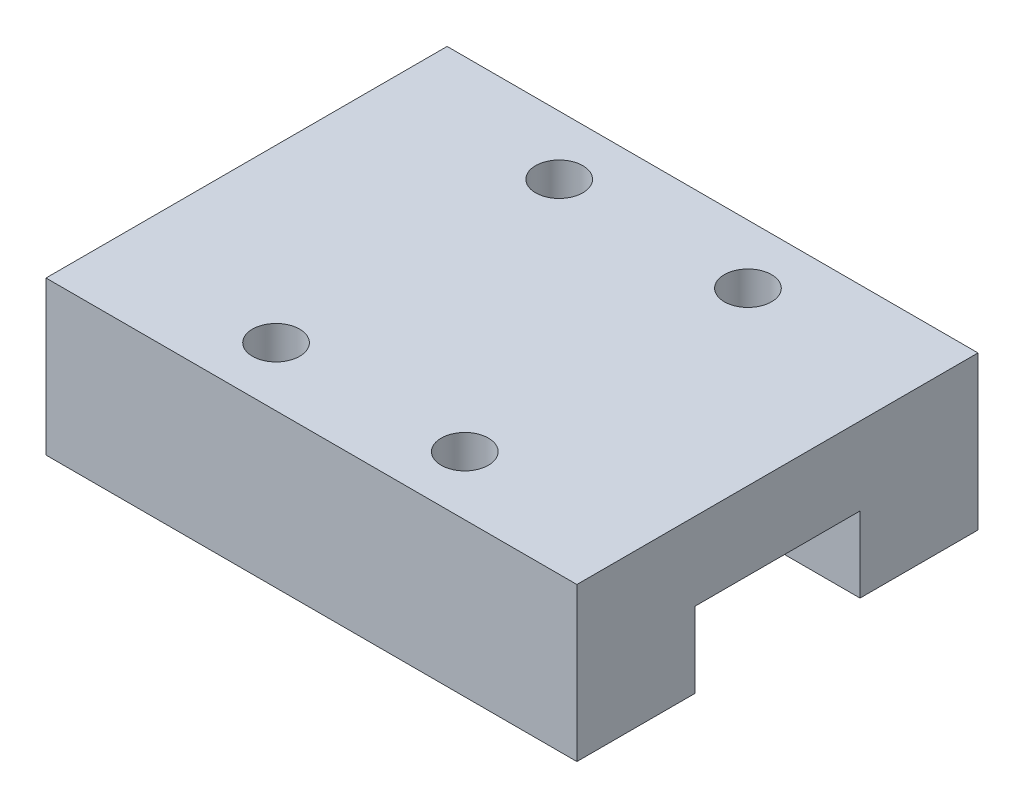
ISO-10303-21;
HEADER;
FILE_DESCRIPTION(('STEP AP214'),'2;1');
FILE_NAME('part.step','',(''),(''),'','','');
FILE_SCHEMA(('AUTOMOTIVE_DESIGN { 1 0 10303 214 1 1 1 1 }'));
ENDSEC;
DATA;
#1=APPLICATION_CONTEXT('core data for automotive mechanical design processes');
#2=APPLICATION_PROTOCOL_DEFINITION('international standard','automotive_design',2000,#1);
#3=PRODUCT_CONTEXT('',#1,'mechanical');
#4=PRODUCT('Part','Part','',(#3));
#5=PRODUCT_RELATED_PRODUCT_CATEGORY('part','',(#4));
#6=PRODUCT_DEFINITION_FORMATION('','',#4);
#7=PRODUCT_DEFINITION_CONTEXT('part definition',#1,'design');
#8=PRODUCT_DEFINITION('design','',#6,#7);
#9=PRODUCT_DEFINITION_SHAPE('','',#8);
#10=(LENGTH_UNIT() NAMED_UNIT(*) SI_UNIT(.MILLI.,.METRE.));
#11=(NAMED_UNIT(*) PLANE_ANGLE_UNIT() SI_UNIT($,.RADIAN.));
#12=(NAMED_UNIT(*) SI_UNIT($,.STERADIAN.) SOLID_ANGLE_UNIT());
#13=UNCERTAINTY_MEASURE_WITH_UNIT(LENGTH_MEASURE(1.E-05),#10,'distance_accuracy_value','');
#14=(GEOMETRIC_REPRESENTATION_CONTEXT(3) GLOBAL_UNCERTAINTY_ASSIGNED_CONTEXT((#13)) GLOBAL_UNIT_ASSIGNED_CONTEXT((#10,
#11,#12)) REPRESENTATION_CONTEXT('',''));
#15=CARTESIAN_POINT('',(0.,0.,0.));
#16=DIRECTION('',(0.,0.,1.));
#17=DIRECTION('',(1.,0.,0.));
#18=AXIS2_PLACEMENT_3D('',#15,#16,#17);
#19=CARTESIAN_POINT('',(0.,0.,0.));
#20=DIRECTION('',(0.,-1.,0.));
#21=DIRECTION('',(0.,0.,-1.));
#22=AXIS2_PLACEMENT_3D('',#19,#20,#21);
#23=PLANE('',#22);
#24=DIRECTION('',(-1.,0.,0.));
#25=VECTOR('',#24,1.);
#26=CARTESIAN_POINT('',(22.5,0.,-12.));
#27=LINE('',#26,#25);
#28=CARTESIAN_POINT('',(22.5,0.,-12.));
#29=VERTEX_POINT('',#28);
#30=CARTESIAN_POINT('',(0.,0.,-12.));
#31=VERTEX_POINT('',#30);
#32=EDGE_CURVE('E114',#29,#31,#27,.T.);
#33=ORIENTED_EDGE('',*,*,#32,.T.);
#34=DIRECTION('',(0.,0.,1.));
#35=VECTOR('',#34,1.);
#36=CARTESIAN_POINT('',(0.,0.,0.));
#37=LINE('',#36,#35);
#38=CARTESIAN_POINT('',(0.,0.,-17.));
#39=VERTEX_POINT('',#38);
#40=EDGE_CURVE('E139',#39,#31,#37,.T.);
#41=ORIENTED_EDGE('',*,*,#40,.F.);
#42=DIRECTION('',(-1.,0.,0.));
#43=VECTOR('',#42,1.);
#44=CARTESIAN_POINT('',(0.,0.,-17.));
#45=LINE('',#44,#43);
#46=CARTESIAN_POINT('',(22.5,0.,-17.));
#47=VERTEX_POINT('',#46);
#48=EDGE_CURVE('E85',#47,#39,#45,.T.);
#49=ORIENTED_EDGE('',*,*,#48,.F.);
#50=DIRECTION('',(0.,0.,-1.));
#51=VECTOR('',#50,1.);
#52=CARTESIAN_POINT('',(22.5,0.,0.));
#53=LINE('',#52,#51);
#54=EDGE_CURVE('E131',#29,#47,#53,.T.);
#55=ORIENTED_EDGE('',*,*,#54,.F.);
#56=EDGE_LOOP('',(#33,#41,#49,#55));
#57=FACE_BOUND('',#56,.T.);
#58=ADVANCED_FACE('F40',(#57),#23,.T.);
#59=CARTESIAN_POINT('',(0.,6.5,0.));
#60=DIRECTION('',(1.,0.,0.));
#61=DIRECTION('',(0.,0.,-1.));
#62=AXIS2_PLACEMENT_3D('',#59,#60,#61);
#63=PLANE('',#62);
#64=ORIENTED_EDGE('',*,*,#40,.T.);
#65=DIRECTION('',(0.,-1.,0.));
#66=VECTOR('',#65,1.);
#67=CARTESIAN_POINT('',(0.,3.2,-12.));
#68=LINE('',#67,#66);
#69=CARTESIAN_POINT('',(0.,3.2,-12.));
#70=VERTEX_POINT('',#69);
#71=EDGE_CURVE('E120',#70,#31,#68,.T.);
#72=ORIENTED_EDGE('',*,*,#71,.F.);
#73=DIRECTION('',(0.,0.,-1.));
#74=VECTOR('',#73,1.);
#75=CARTESIAN_POINT('',(0.,3.2,-12.));
#76=LINE('',#75,#74);
#77=CARTESIAN_POINT('',(0.,3.2,-5.));
#78=VERTEX_POINT('',#77);
#79=EDGE_CURVE('E133',#78,#70,#76,.T.);
#80=ORIENTED_EDGE('',*,*,#79,.F.);
#81=DIRECTION('',(0.,1.,0.));
#82=VECTOR('',#81,1.);
#83=CARTESIAN_POINT('',(0.,3.2,-5.));
#84=LINE('',#83,#82);
#85=CARTESIAN_POINT('',(0.,0.,-5.));
#86=VERTEX_POINT('',#85);
#87=EDGE_CURVE('E173',#86,#78,#84,.T.);
#88=ORIENTED_EDGE('',*,*,#87,.F.);
#89=CARTESIAN_POINT('',(0.,0.,0.));
#90=VERTEX_POINT('',#89);
#91=EDGE_CURVE('E156',#86,#90,#37,.T.);
#92=ORIENTED_EDGE('',*,*,#91,.T.);
#93=DIRECTION('',(0.,-1.,0.));
#94=VECTOR('',#93,1.);
#95=CARTESIAN_POINT('',(0.,6.5,0.));
#96=LINE('',#95,#94);
#97=CARTESIAN_POINT('',(0.,6.5,0.));
#98=VERTEX_POINT('',#97);
#99=EDGE_CURVE('E11',#98,#90,#96,.T.);
#100=ORIENTED_EDGE('',*,*,#99,.F.);
#101=DIRECTION('',(0.,0.,1.));
#102=VECTOR('',#101,1.);
#103=CARTESIAN_POINT('',(0.,6.5,0.));
#104=LINE('',#103,#102);
#105=CARTESIAN_POINT('',(0.,6.5,-17.));
#106=VERTEX_POINT('',#105);
#107=EDGE_CURVE('E144',#106,#98,#104,.T.);
#108=ORIENTED_EDGE('',*,*,#107,.F.);
#109=DIRECTION('',(0.,-1.,0.));
#110=VECTOR('',#109,1.);
#111=CARTESIAN_POINT('',(0.,6.5,-17.));
#112=LINE('',#111,#110);
#113=EDGE_CURVE('E145',#106,#39,#112,.T.);
#114=ORIENTED_EDGE('',*,*,#113,.T.);
#115=EDGE_LOOP('',(#64,#72,#80,#88,#92,#100,#108,#114));
#116=FACE_BOUND('',#115,.T.);
#117=ADVANCED_FACE('F42',(#116),#63,.F.);
#118=CARTESIAN_POINT('',(0.,6.5,0.));
#119=DIRECTION('',(0.,0.,-1.));
#120=DIRECTION('',(-1.,0.,0.));
#121=AXIS2_PLACEMENT_3D('',#118,#119,#120);
#122=PLANE('',#121);
#123=DIRECTION('',(1.,0.,0.));
#124=VECTOR('',#123,1.);
#125=CARTESIAN_POINT('',(0.,0.,0.));
#126=LINE('',#125,#124);
#127=CARTESIAN_POINT('',(22.5,0.,0.));
#128=VERTEX_POINT('',#127);
#129=EDGE_CURVE('E136',#90,#128,#126,.T.);
#130=ORIENTED_EDGE('',*,*,#129,.T.);
#131=DIRECTION('',(0.,-1.,0.));
#132=VECTOR('',#131,1.);
#133=CARTESIAN_POINT('',(22.5,6.5,0.));
#134=LINE('',#133,#132);
#135=CARTESIAN_POINT('',(22.5,6.5,0.));
#136=VERTEX_POINT('',#135);
#137=EDGE_CURVE('E48',#136,#128,#134,.T.);
#138=ORIENTED_EDGE('',*,*,#137,.F.);
#139=DIRECTION('',(1.,0.,0.));
#140=VECTOR('',#139,1.);
#141=CARTESIAN_POINT('',(0.,6.5,0.));
#142=LINE('',#141,#140);
#143=EDGE_CURVE('E92',#98,#136,#142,.T.);
#144=ORIENTED_EDGE('',*,*,#143,.F.);
#145=ORIENTED_EDGE('',*,*,#99,.T.);
#146=EDGE_LOOP('',(#130,#138,#144,#145));
#147=FACE_BOUND('',#146,.T.);
#148=ADVANCED_FACE('F213',(#147),#122,.F.);
#149=CARTESIAN_POINT('',(22.5,6.5,0.));
#150=DIRECTION('',(-1.,0.,0.));
#151=DIRECTION('',(0.,0.,1.));
#152=AXIS2_PLACEMENT_3D('',#149,#150,#151);
#153=PLANE('',#152);
#154=DIRECTION('',(0.,0.,-1.));
#155=VECTOR('',#154,1.);
#156=CARTESIAN_POINT('',(22.5,3.2,-12.));
#157=LINE('',#156,#155);
#158=CARTESIAN_POINT('',(22.5,3.2,-5.));
#159=VERTEX_POINT('',#158);
#160=CARTESIAN_POINT('',(22.5,3.2,-12.));
#161=VERTEX_POINT('',#160);
#162=EDGE_CURVE('E126',#159,#161,#157,.T.);
#163=ORIENTED_EDGE('',*,*,#162,.T.);
#164=DIRECTION('',(0.,-1.,0.));
#165=VECTOR('',#164,1.);
#166=CARTESIAN_POINT('',(22.5,3.2,-12.));
#167=LINE('',#166,#165);
#168=EDGE_CURVE('E117',#161,#29,#167,.T.);
#169=ORIENTED_EDGE('',*,*,#168,.T.);
#170=ORIENTED_EDGE('',*,*,#54,.T.);
#171=DIRECTION('',(0.,-1.,0.));
#172=VECTOR('',#171,1.);
#173=CARTESIAN_POINT('',(22.5,6.5,-17.));
#174=LINE('',#173,#172);
#175=CARTESIAN_POINT('',(22.5,6.5,-17.));
#176=VERTEX_POINT('',#175);
#177=EDGE_CURVE('E147',#176,#47,#174,.T.);
#178=ORIENTED_EDGE('',*,*,#177,.F.);
#179=DIRECTION('',(0.,0.,-1.));
#180=VECTOR('',#179,1.);
#181=CARTESIAN_POINT('',(22.5,6.5,0.));
#182=LINE('',#181,#180);
#183=EDGE_CURVE('E151',#136,#176,#182,.T.);
#184=ORIENTED_EDGE('',*,*,#183,.F.);
#185=ORIENTED_EDGE('',*,*,#137,.T.);
#186=CARTESIAN_POINT('',(22.5,0.,-5.));
#187=VERTEX_POINT('',#186);
#188=EDGE_CURVE('E135',#128,#187,#53,.T.);
#189=ORIENTED_EDGE('',*,*,#188,.T.);
#190=DIRECTION('',(0.,1.,0.));
#191=VECTOR('',#190,1.);
#192=CARTESIAN_POINT('',(22.5,3.2,-5.));
#193=LINE('',#192,#191);
#194=EDGE_CURVE('E55',#187,#159,#193,.T.);
#195=ORIENTED_EDGE('',*,*,#194,.T.);
#196=EDGE_LOOP('',(#163,#169,#170,#178,#184,#185,#189,#195));
#197=FACE_BOUND('',#196,.T.);
#198=ADVANCED_FACE('F129',(#197),#153,.F.);
#199=CARTESIAN_POINT('',(0.,6.5,-17.));
#200=DIRECTION('',(0.,0.,1.));
#201=DIRECTION('',(1.,0.,0.));
#202=AXIS2_PLACEMENT_3D('',#199,#200,#201);
#203=PLANE('',#202);
#204=ORIENTED_EDGE('',*,*,#48,.T.);
#205=ORIENTED_EDGE('',*,*,#113,.F.);
#206=DIRECTION('',(-1.,0.,0.));
#207=VECTOR('',#206,1.);
#208=CARTESIAN_POINT('',(0.,6.5,-17.));
#209=LINE('',#208,#207);
#210=EDGE_CURVE('E64',#176,#106,#209,.T.);
#211=ORIENTED_EDGE('',*,*,#210,.F.);
#212=ORIENTED_EDGE('',*,*,#177,.T.);
#213=EDGE_LOOP('',(#204,#205,#211,#212));
#214=FACE_BOUND('',#213,.T.);
#215=ADVANCED_FACE('F208',(#214),#203,.F.);
#216=CARTESIAN_POINT('',(0.,6.5,0.));
#217=DIRECTION('',(0.,-1.,0.));
#218=DIRECTION('',(0.,0.,-1.));
#219=AXIS2_PLACEMENT_3D('',#216,#217,#218);
#220=PLANE('',#219);
#221=CARTESIAN_POINT('',(7.25,6.5,-2.5));
#222=DIRECTION('',(0.,1.,0.));
#223=DIRECTION('',(0.,0.,-1.));
#224=AXIS2_PLACEMENT_3D('',#221,#222,#223);
#225=CIRCLE('',#224,0.999999999999996);
#226=CARTESIAN_POINT('',(7.25,6.5,-3.5));
#227=VERTEX_POINT('',#226);
#228=EDGE_CURVE('E188',#227,#227,#225,.T.);
#229=ORIENTED_EDGE('',*,*,#228,.F.);
#230=EDGE_LOOP('',(#229));
#231=FACE_BOUND('',#230,.T.);
#232=CARTESIAN_POINT('',(15.25,6.5,-2.5));
#233=DIRECTION('',(0.,1.,0.));
#234=DIRECTION('',(0.,0.,-1.));
#235=AXIS2_PLACEMENT_3D('',#232,#233,#234);
#236=CIRCLE('',#235,0.999999999999998);
#237=CARTESIAN_POINT('',(15.25,6.5,-3.5));
#238=VERTEX_POINT('',#237);
#239=EDGE_CURVE('E194',#238,#238,#236,.T.);
#240=ORIENTED_EDGE('',*,*,#239,.F.);
#241=EDGE_LOOP('',(#240));
#242=FACE_BOUND('',#241,.T.);
#243=CARTESIAN_POINT('',(15.25,6.5,-14.5));
#244=DIRECTION('',(0.,1.,0.));
#245=DIRECTION('',(0.,0.,1.));
#246=AXIS2_PLACEMENT_3D('',#243,#244,#245);
#247=CIRCLE('',#246,1.00000000000001);
#248=CARTESIAN_POINT('',(15.25,6.5,-13.5));
#249=VERTEX_POINT('',#248);
#250=EDGE_CURVE('E182',#249,#249,#247,.T.);
#251=ORIENTED_EDGE('',*,*,#250,.F.);
#252=EDGE_LOOP('',(#251));
#253=FACE_BOUND('',#252,.T.);
#254=CARTESIAN_POINT('',(7.25,6.5,-14.5));
#255=DIRECTION('',(0.,1.,0.));
#256=DIRECTION('',(0.,0.,1.));
#257=AXIS2_PLACEMENT_3D('',#254,#255,#256);
#258=CIRCLE('',#257,0.999999999999999);
#259=CARTESIAN_POINT('',(7.25,6.5,-13.5));
#260=VERTEX_POINT('',#259);
#261=EDGE_CURVE('E179',#260,#260,#258,.T.);
#262=ORIENTED_EDGE('',*,*,#261,.F.);
#263=EDGE_LOOP('',(#262));
#264=FACE_BOUND('',#263,.T.);
#265=ORIENTED_EDGE('',*,*,#107,.T.);
#266=ORIENTED_EDGE('',*,*,#143,.T.);
#267=ORIENTED_EDGE('',*,*,#183,.T.);
#268=ORIENTED_EDGE('',*,*,#210,.T.);
#269=EDGE_LOOP('',(#265,#266,#267,#268));
#270=FACE_BOUND('',#269,.T.);
#271=ADVANCED_FACE('F205',(#231,#242,#253,#264,#270),#220,.F.);
#272=DIRECTION('',(-1.,0.,0.));
#273=VECTOR('',#272,1.);
#274=CARTESIAN_POINT('',(22.5,0.,-5.));
#275=LINE('',#274,#273);
#276=EDGE_CURVE('E125',#187,#86,#275,.T.);
#277=ORIENTED_EDGE('',*,*,#276,.F.);
#278=ORIENTED_EDGE('',*,*,#188,.F.);
#279=ORIENTED_EDGE('',*,*,#129,.F.);
#280=ORIENTED_EDGE('',*,*,#91,.F.);
#281=EDGE_LOOP('',(#277,#278,#279,#280));
#282=FACE_BOUND('',#281,.T.);
#283=ADVANCED_FACE('F154',(#282),#23,.T.);
#284=CARTESIAN_POINT('',(22.5,3.2,-12.));
#285=DIRECTION('',(0.,0.,-1.));
#286=DIRECTION('',(-1.,0.,0.));
#287=AXIS2_PLACEMENT_3D('',#284,#285,#286);
#288=PLANE('',#287);
#289=ORIENTED_EDGE('',*,*,#71,.T.);
#290=ORIENTED_EDGE('',*,*,#32,.F.);
#291=ORIENTED_EDGE('',*,*,#168,.F.);
#292=DIRECTION('',(-1.,0.,0.));
#293=VECTOR('',#292,1.);
#294=CARTESIAN_POINT('',(22.5,3.2,-12.));
#295=LINE('',#294,#293);
#296=EDGE_CURVE('E161',#161,#70,#295,.T.);
#297=ORIENTED_EDGE('',*,*,#296,.T.);
#298=EDGE_LOOP('',(#289,#290,#291,#297));
#299=FACE_BOUND('',#298,.T.);
#300=ADVANCED_FACE('F116',(#299),#288,.F.);
#301=CARTESIAN_POINT('',(22.5,3.2,-12.));
#302=DIRECTION('',(0.,1.,0.));
#303=DIRECTION('',(0.,0.,1.));
#304=AXIS2_PLACEMENT_3D('',#301,#302,#303);
#305=PLANE('',#304);
#306=ORIENTED_EDGE('',*,*,#79,.T.);
#307=ORIENTED_EDGE('',*,*,#296,.F.);
#308=ORIENTED_EDGE('',*,*,#162,.F.);
#309=DIRECTION('',(-1.,0.,0.));
#310=VECTOR('',#309,1.);
#311=CARTESIAN_POINT('',(22.5,3.2,-5.));
#312=LINE('',#311,#310);
#313=EDGE_CURVE('E159',#159,#78,#312,.T.);
#314=ORIENTED_EDGE('',*,*,#313,.T.);
#315=EDGE_LOOP('',(#306,#307,#308,#314));
#316=FACE_BOUND('',#315,.T.);
#317=ADVANCED_FACE('F229',(#316),#305,.F.);
#318=CARTESIAN_POINT('',(22.5,3.2,-5.));
#319=DIRECTION('',(0.,0.,1.));
#320=DIRECTION('',(0.,-1.,0.));
#321=AXIS2_PLACEMENT_3D('',#318,#319,#320);
#322=PLANE('',#321);
#323=ORIENTED_EDGE('',*,*,#87,.T.);
#324=ORIENTED_EDGE('',*,*,#313,.F.);
#325=ORIENTED_EDGE('',*,*,#194,.F.);
#326=ORIENTED_EDGE('',*,*,#276,.T.);
#327=EDGE_LOOP('',(#323,#324,#325,#326));
#328=FACE_BOUND('',#327,.T.);
#329=ADVANCED_FACE('F234',(#328),#322,.F.);
#330=CARTESIAN_POINT('',(7.25,4.1,-14.5));
#331=DIRECTION('',(0.,1.,0.));
#332=DIRECTION('',(0.,0.,1.));
#333=AXIS2_PLACEMENT_3D('',#330,#331,#332);
#334=CYLINDRICAL_SURFACE('',#333,0.999999999999999);
#335=CARTESIAN_POINT('',(7.25,4.1,-14.5));
#336=DIRECTION('',(0.,1.,0.));
#337=DIRECTION('',(0.,0.,1.));
#338=AXIS2_PLACEMENT_3D('',#335,#336,#337);
#339=CIRCLE('',#338,0.999999999999999);
#340=CARTESIAN_POINT('',(7.25,4.1,-13.5));
#341=VERTEX_POINT('',#340);
#342=EDGE_CURVE('E176',#341,#341,#339,.T.);
#343=ORIENTED_EDGE('',*,*,#342,.F.);
#344=EDGE_LOOP('',(#343));
#345=FACE_BOUND('',#344,.T.);
#346=ORIENTED_EDGE('',*,*,#261,.T.);
#347=EDGE_LOOP('',(#346));
#348=FACE_BOUND('',#347,.T.);
#349=ADVANCED_FACE('F239',(#345,#348),#334,.F.);
#350=CARTESIAN_POINT('',(7.25,4.1,-14.5));
#351=DIRECTION('',(0.,1.,0.));
#352=DIRECTION('',(0.,0.,1.));
#353=AXIS2_PLACEMENT_3D('',#350,#351,#352);
#354=PLANE('',#353);
#355=ORIENTED_EDGE('',*,*,#342,.T.);
#356=EDGE_LOOP('',(#355));
#357=FACE_BOUND('',#356,.T.);
#358=ADVANCED_FACE('F243',(#357),#354,.T.);
#359=CARTESIAN_POINT('',(15.25,4.1,-14.5));
#360=DIRECTION('',(0.,1.,0.));
#361=DIRECTION('',(0.,0.,1.));
#362=AXIS2_PLACEMENT_3D('',#359,#360,#361);
#363=CYLINDRICAL_SURFACE('',#362,1.00000000000001);
#364=CARTESIAN_POINT('',(15.25,4.1,-14.5));
#365=DIRECTION('',(0.,1.,0.));
#366=DIRECTION('',(0.,0.,1.));
#367=AXIS2_PLACEMENT_3D('',#364,#365,#366);
#368=CIRCLE('',#367,1.00000000000001);
#369=CARTESIAN_POINT('',(15.25,4.1,-13.5));
#370=VERTEX_POINT('',#369);
#371=EDGE_CURVE('E197',#370,#370,#368,.T.);
#372=ORIENTED_EDGE('',*,*,#371,.F.);
#373=EDGE_LOOP('',(#372));
#374=FACE_BOUND('',#373,.T.);
#375=ORIENTED_EDGE('',*,*,#250,.T.);
#376=EDGE_LOOP('',(#375));
#377=FACE_BOUND('',#376,.T.);
#378=ADVANCED_FACE('F203',(#374,#377),#363,.F.);
#379=CARTESIAN_POINT('',(15.25,4.1,-14.5));
#380=DIRECTION('',(0.,1.,0.));
#381=DIRECTION('',(0.,0.,1.));
#382=AXIS2_PLACEMENT_3D('',#379,#380,#381);
#383=PLANE('',#382);
#384=ORIENTED_EDGE('',*,*,#371,.T.);
#385=EDGE_LOOP('',(#384));
#386=FACE_BOUND('',#385,.T.);
#387=ADVANCED_FACE('F263',(#386),#383,.T.);
#388=CARTESIAN_POINT('',(15.25,4.1,-2.5));
#389=DIRECTION('',(0.,1.,0.));
#390=DIRECTION('',(0.,0.,1.));
#391=AXIS2_PLACEMENT_3D('',#388,#389,#390);
#392=CYLINDRICAL_SURFACE('',#391,0.999999999999998);
#393=CARTESIAN_POINT('',(15.25,4.1,-2.5));
#394=DIRECTION('',(0.,1.,0.));
#395=DIRECTION('',(0.,0.,-1.));
#396=AXIS2_PLACEMENT_3D('',#393,#394,#395);
#397=CIRCLE('',#396,0.999999999999998);
#398=CARTESIAN_POINT('',(15.25,4.1,-3.5));
#399=VERTEX_POINT('',#398);
#400=EDGE_CURVE('E191',#399,#399,#397,.T.);
#401=ORIENTED_EDGE('',*,*,#400,.F.);
#402=EDGE_LOOP('',(#401));
#403=FACE_BOUND('',#402,.T.);
#404=ORIENTED_EDGE('',*,*,#239,.T.);
#405=EDGE_LOOP('',(#404));
#406=FACE_BOUND('',#405,.T.);
#407=ADVANCED_FACE('F259',(#403,#406),#392,.F.);
#408=CARTESIAN_POINT('',(15.25,4.1,-2.5));
#409=DIRECTION('',(0.,-1.,0.));
#410=DIRECTION('',(0.,0.,-1.));
#411=AXIS2_PLACEMENT_3D('',#408,#409,#410);
#412=PLANE('',#411);
#413=ORIENTED_EDGE('',*,*,#400,.T.);
#414=EDGE_LOOP('',(#413));
#415=FACE_BOUND('',#414,.T.);
#416=ADVANCED_FACE('F255',(#415),#412,.F.);
#417=CARTESIAN_POINT('',(7.25,4.1,-2.5));
#418=DIRECTION('',(0.,1.,0.));
#419=DIRECTION('',(0.,0.,1.));
#420=AXIS2_PLACEMENT_3D('',#417,#418,#419);
#421=CYLINDRICAL_SURFACE('',#420,0.999999999999996);
#422=CARTESIAN_POINT('',(7.25,4.1,-2.5));
#423=DIRECTION('',(0.,1.,0.));
#424=DIRECTION('',(0.,0.,-1.));
#425=AXIS2_PLACEMENT_3D('',#422,#423,#424);
#426=CIRCLE('',#425,0.999999999999996);
#427=CARTESIAN_POINT('',(7.25,4.1,-3.5));
#428=VERTEX_POINT('',#427);
#429=EDGE_CURVE('E185',#428,#428,#426,.T.);
#430=ORIENTED_EDGE('',*,*,#429,.F.);
#431=EDGE_LOOP('',(#430));
#432=FACE_BOUND('',#431,.T.);
#433=ORIENTED_EDGE('',*,*,#228,.T.);
#434=EDGE_LOOP('',(#433));
#435=FACE_BOUND('',#434,.T.);
#436=ADVANCED_FACE('F251',(#432,#435),#421,.F.);
#437=CARTESIAN_POINT('',(7.25,4.1,-2.5));
#438=DIRECTION('',(0.,-1.,0.));
#439=DIRECTION('',(0.,0.,-1.));
#440=AXIS2_PLACEMENT_3D('',#437,#438,#439);
#441=PLANE('',#440);
#442=ORIENTED_EDGE('',*,*,#429,.T.);
#443=EDGE_LOOP('',(#442));
#444=FACE_BOUND('',#443,.T.);
#445=ADVANCED_FACE('F248',(#444),#441,.F.);
#446=CLOSED_SHELL('',(#58,#117,#148,#198,#215,#271,#283,#300,#317,#329,#349,#358,#378,#387,#407,
#416,#436,#445));
#447=MANIFOLD_SOLID_BREP('B2',#446);
#448=ADVANCED_BREP_SHAPE_REPRESENTATION('',(#18,#447),#14);
#449=SHAPE_DEFINITION_REPRESENTATION(#9,#448);
ENDSEC;
END-ISO-10303-21;
